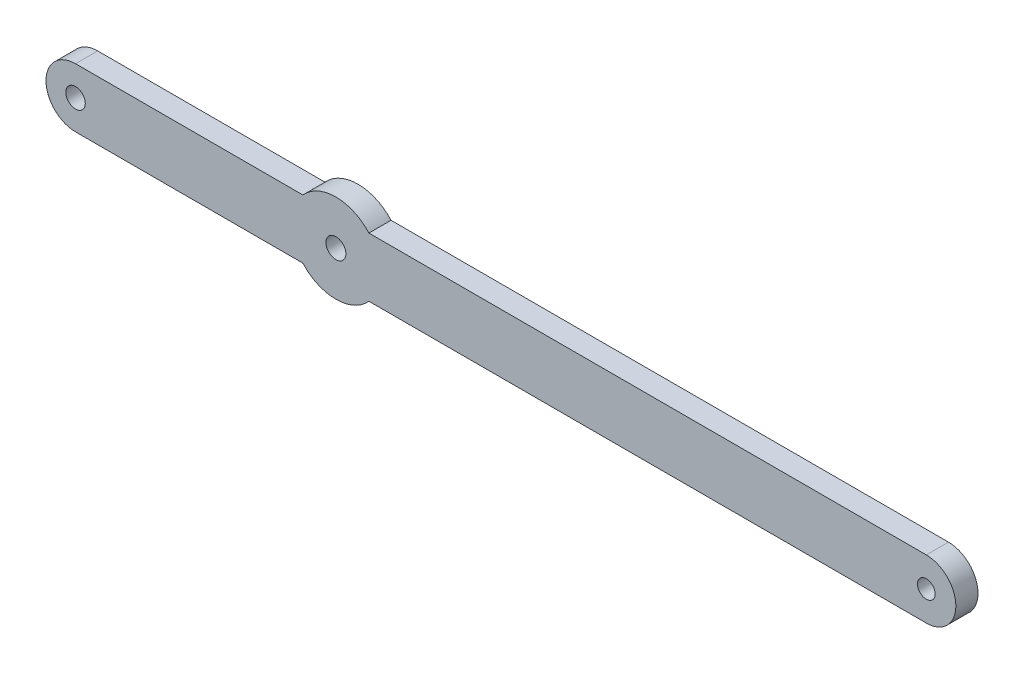
ISO-10303-21;
HEADER;
FILE_DESCRIPTION(('STEP AP214'),'2;1');
FILE_NAME('part.step','',(''),(''),'','','');
FILE_SCHEMA(('AUTOMOTIVE_DESIGN { 1 0 10303 214 1 1 1 1 }'));
ENDSEC;
DATA;
#1=APPLICATION_CONTEXT('core data for automotive mechanical design processes');
#2=APPLICATION_PROTOCOL_DEFINITION('international standard','automotive_design',2000,#1);
#3=PRODUCT_CONTEXT('',#1,'mechanical');
#4=PRODUCT('Part','Part','',(#3));
#5=PRODUCT_RELATED_PRODUCT_CATEGORY('part','',(#4));
#6=PRODUCT_DEFINITION_FORMATION('','',#4);
#7=PRODUCT_DEFINITION_CONTEXT('part definition',#1,'design');
#8=PRODUCT_DEFINITION('design','',#6,#7);
#9=PRODUCT_DEFINITION_SHAPE('','',#8);
#10=(LENGTH_UNIT() NAMED_UNIT(*) SI_UNIT(.MILLI.,.METRE.));
#11=(NAMED_UNIT(*) PLANE_ANGLE_UNIT() SI_UNIT($,.RADIAN.));
#12=(NAMED_UNIT(*) SI_UNIT($,.STERADIAN.) SOLID_ANGLE_UNIT());
#13=UNCERTAINTY_MEASURE_WITH_UNIT(LENGTH_MEASURE(1.E-05),#10,'distance_accuracy_value','');
#14=(GEOMETRIC_REPRESENTATION_CONTEXT(3) GLOBAL_UNCERTAINTY_ASSIGNED_CONTEXT((#13)) GLOBAL_UNIT_ASSIGNED_CONTEXT((#10,
#11,#12)) REPRESENTATION_CONTEXT('',''));
#15=CARTESIAN_POINT('',(0.,0.,0.));
#16=DIRECTION('',(0.,0.,1.));
#17=DIRECTION('',(1.,0.,0.));
#18=AXIS2_PLACEMENT_3D('',#15,#16,#17);
#19=CARTESIAN_POINT('',(-91.2186638136628,3.51409457484099,3.));
#20=DIRECTION('',(0.,0.,-1.));
#21=DIRECTION('',(-1.,0.,0.));
#22=AXIS2_PLACEMENT_3D('',#19,#20,#21);
#23=CYLINDRICAL_SURFACE('',#22,4.);
#24=CARTESIAN_POINT('',(-91.2186638136628,3.51409457484099,0.));
#25=DIRECTION('',(0.,0.,-1.));
#26=DIRECTION('',(-1.,0.,0.));
#27=AXIS2_PLACEMENT_3D('',#24,#25,#26);
#28=CIRCLE('',#27,4.);
#29=CARTESIAN_POINT('',(-91.2186638136628,-0.485905425159017,0.));
#30=VERTEX_POINT('',#29);
#31=CARTESIAN_POINT('',(-91.2186638136628,7.51409457484098,0.));
#32=VERTEX_POINT('',#31);
#33=EDGE_CURVE('E133',#30,#32,#28,.T.);
#34=ORIENTED_EDGE('',*,*,#33,.F.);
#35=DIRECTION('',(0.,0.,-1.));
#36=VECTOR('',#35,1.);
#37=CARTESIAN_POINT('',(-91.2186638136628,-0.485905425159017,3.));
#38=LINE('',#37,#36);
#39=CARTESIAN_POINT('',(-91.2186638136628,-0.485905425159017,3.));
#40=VERTEX_POINT('',#39);
#41=EDGE_CURVE('E11',#40,#30,#38,.T.);
#42=ORIENTED_EDGE('',*,*,#41,.F.);
#43=CARTESIAN_POINT('',(-91.2186638136628,3.51409457484099,3.));
#44=DIRECTION('',(0.,0.,-1.));
#45=DIRECTION('',(-1.,0.,0.));
#46=AXIS2_PLACEMENT_3D('',#43,#44,#45);
#47=CIRCLE('',#46,4.);
#48=CARTESIAN_POINT('',(-91.2186638136628,7.51409457484098,3.));
#49=VERTEX_POINT('',#48);
#50=EDGE_CURVE('E154',#40,#49,#47,.T.);
#51=ORIENTED_EDGE('',*,*,#50,.T.);
#52=DIRECTION('',(0.,0.,-1.));
#53=VECTOR('',#52,1.);
#54=CARTESIAN_POINT('',(-91.2186638136628,7.51409457484098,3.));
#55=LINE('',#54,#53);
#56=EDGE_CURVE('E39',#49,#32,#55,.T.);
#57=ORIENTED_EDGE('',*,*,#56,.T.);
#58=EDGE_LOOP('',(#34,#42,#51,#57));
#59=FACE_BOUND('',#58,.T.);
#60=ADVANCED_FACE('F36',(#59),#23,.T.);
#61=CARTESIAN_POINT('',(-60.4264175614243,-0.485905425159017,3.));
#62=DIRECTION('',(0.,-1.,0.));
#63=DIRECTION('',(0.,0.,-1.));
#64=AXIS2_PLACEMENT_3D('',#61,#62,#63);
#65=PLANE('',#64);
#66=DIRECTION('',(-1.,0.,0.));
#67=VECTOR('',#66,1.);
#68=CARTESIAN_POINT('',(-60.4264175614243,-0.485905425159017,0.));
#69=LINE('',#68,#67);
#70=CARTESIAN_POINT('',(-60.4264175614243,-0.485905425159017,0.));
#71=VERTEX_POINT('',#70);
#72=EDGE_CURVE('E152',#71,#30,#69,.T.);
#73=ORIENTED_EDGE('',*,*,#72,.F.);
#74=DIRECTION('',(0.,0.,-1.));
#75=VECTOR('',#74,1.);
#76=CARTESIAN_POINT('',(-60.4264175614243,-0.485905425159017,3.));
#77=LINE('',#76,#75);
#78=CARTESIAN_POINT('',(-60.4264175614243,-0.485905425159017,3.));
#79=VERTEX_POINT('',#78);
#80=EDGE_CURVE('E45',#79,#71,#77,.T.);
#81=ORIENTED_EDGE('',*,*,#80,.F.);
#82=DIRECTION('',(-1.,0.,0.));
#83=VECTOR('',#82,1.);
#84=CARTESIAN_POINT('',(-60.4264175614243,-0.485905425159017,3.));
#85=LINE('',#84,#83);
#86=EDGE_CURVE('E123',#79,#40,#85,.T.);
#87=ORIENTED_EDGE('',*,*,#86,.T.);
#88=ORIENTED_EDGE('',*,*,#41,.T.);
#89=EDGE_LOOP('',(#73,#81,#87,#88));
#90=FACE_BOUND('',#89,.T.);
#91=ADVANCED_FACE('F166',(#90),#65,.T.);
#92=CARTESIAN_POINT('',(-55.9542816064248,3.51409457484091,3.));
#93=DIRECTION('',(0.,0.,-1.));
#94=DIRECTION('',(-1.,0.,0.));
#95=AXIS2_PLACEMENT_3D('',#92,#93,#94);
#96=CYLINDRICAL_SURFACE('',#95,5.99999999999997);
#97=CARTESIAN_POINT('',(-55.9542816064248,3.51409457484091,0.));
#98=DIRECTION('',(0.,0.,-1.));
#99=DIRECTION('',(-1.,0.,0.));
#100=AXIS2_PLACEMENT_3D('',#97,#98,#99);
#101=CIRCLE('',#100,5.99999999999997);
#102=CARTESIAN_POINT('',(-51.4821456514252,-0.485905425158969,0.));
#103=VERTEX_POINT('',#102);
#104=EDGE_CURVE('E110',#103,#71,#101,.T.);
#105=ORIENTED_EDGE('',*,*,#104,.F.);
#106=DIRECTION('',(0.,0.,-1.));
#107=VECTOR('',#106,1.);
#108=CARTESIAN_POINT('',(-51.4821456514252,-0.485905425158969,3.));
#109=LINE('',#108,#107);
#110=CARTESIAN_POINT('',(-51.4821456514252,-0.485905425158969,3.));
#111=VERTEX_POINT('',#110);
#112=EDGE_CURVE('E105',#111,#103,#109,.T.);
#113=ORIENTED_EDGE('',*,*,#112,.F.);
#114=CARTESIAN_POINT('',(-55.9542816064248,3.51409457484091,3.));
#115=DIRECTION('',(0.,0.,-1.));
#116=DIRECTION('',(-1.,0.,0.));
#117=AXIS2_PLACEMENT_3D('',#114,#115,#116);
#118=CIRCLE('',#117,5.99999999999997);
#119=EDGE_CURVE('E108',#111,#79,#118,.T.);
#120=ORIENTED_EDGE('',*,*,#119,.T.);
#121=ORIENTED_EDGE('',*,*,#80,.T.);
#122=EDGE_LOOP('',(#105,#113,#120,#121));
#123=FACE_BOUND('',#122,.T.);
#124=ADVANCED_FACE('F107',(#123),#96,.T.);
#125=CARTESIAN_POINT('',(24.0198349794059,-0.485905425159017,3.));
#126=DIRECTION('',(0.,-1.,0.));
#127=DIRECTION('',(0.,0.,-1.));
#128=AXIS2_PLACEMENT_3D('',#125,#126,#127);
#129=PLANE('',#128);
#130=DIRECTION('',(-1.,0.,0.));
#131=VECTOR('',#130,1.);
#132=CARTESIAN_POINT('',(24.0198349794059,-0.485905425159017,0.));
#133=LINE('',#132,#131);
#134=CARTESIAN_POINT('',(24.0198349794059,-0.485905425159017,0.));
#135=VERTEX_POINT('',#134);
#136=EDGE_CURVE('E149',#135,#103,#133,.T.);
#137=ORIENTED_EDGE('',*,*,#136,.F.);
#138=DIRECTION('',(0.,0.,-1.));
#139=VECTOR('',#138,1.);
#140=CARTESIAN_POINT('',(24.0198349794059,-0.485905425159017,3.));
#141=LINE('',#140,#139);
#142=CARTESIAN_POINT('',(24.0198349794059,-0.485905425159017,3.));
#143=VERTEX_POINT('',#142);
#144=EDGE_CURVE('E115',#143,#135,#141,.T.);
#145=ORIENTED_EDGE('',*,*,#144,.F.);
#146=DIRECTION('',(-1.,0.,0.));
#147=VECTOR('',#146,1.);
#148=CARTESIAN_POINT('',(24.0198349794059,-0.485905425159017,3.));
#149=LINE('',#148,#147);
#150=EDGE_CURVE('E121',#143,#111,#149,.T.);
#151=ORIENTED_EDGE('',*,*,#150,.T.);
#152=ORIENTED_EDGE('',*,*,#112,.T.);
#153=EDGE_LOOP('',(#137,#145,#151,#152));
#154=FACE_BOUND('',#153,.T.);
#155=ADVANCED_FACE('F125',(#154),#129,.T.);
#156=CARTESIAN_POINT('',(24.0198349794059,3.51409457484099,3.));
#157=DIRECTION('',(0.,0.,-1.));
#158=DIRECTION('',(-1.,0.,0.));
#159=AXIS2_PLACEMENT_3D('',#156,#157,#158);
#160=CYLINDRICAL_SURFACE('',#159,4.);
#161=CARTESIAN_POINT('',(24.0198349794059,3.51409457484099,0.));
#162=DIRECTION('',(0.,0.,-1.));
#163=DIRECTION('',(-1.,0.,0.));
#164=AXIS2_PLACEMENT_3D('',#161,#162,#163);
#165=CIRCLE('',#164,4.);
#166=CARTESIAN_POINT('',(24.0198349794059,7.51409457484098,0.));
#167=VERTEX_POINT('',#166);
#168=EDGE_CURVE('E146',#167,#135,#165,.T.);
#169=ORIENTED_EDGE('',*,*,#168,.F.);
#170=DIRECTION('',(0.,0.,-1.));
#171=VECTOR('',#170,1.);
#172=CARTESIAN_POINT('',(24.0198349794059,7.51409457484098,3.));
#173=LINE('',#172,#171);
#174=CARTESIAN_POINT('',(24.0198349794059,7.51409457484098,3.));
#175=VERTEX_POINT('',#174);
#176=EDGE_CURVE('E158',#175,#167,#173,.T.);
#177=ORIENTED_EDGE('',*,*,#176,.F.);
#178=CARTESIAN_POINT('',(24.0198349794059,3.51409457484099,3.));
#179=DIRECTION('',(0.,0.,-1.));
#180=DIRECTION('',(-1.,0.,0.));
#181=AXIS2_PLACEMENT_3D('',#178,#179,#180);
#182=CIRCLE('',#181,4.);
#183=EDGE_CURVE('E126',#175,#143,#182,.T.);
#184=ORIENTED_EDGE('',*,*,#183,.T.);
#185=ORIENTED_EDGE('',*,*,#144,.T.);
#186=EDGE_LOOP('',(#169,#177,#184,#185));
#187=FACE_BOUND('',#186,.T.);
#188=ADVANCED_FACE('F179',(#187),#160,.T.);
#189=CARTESIAN_POINT('',(-51.4821456514252,7.51409457484098,3.));
#190=DIRECTION('',(0.,1.,0.));
#191=DIRECTION('',(0.,0.,1.));
#192=AXIS2_PLACEMENT_3D('',#189,#190,#191);
#193=PLANE('',#192);
#194=DIRECTION('',(1.,0.,0.));
#195=VECTOR('',#194,1.);
#196=CARTESIAN_POINT('',(-51.4821456514252,7.51409457484098,0.));
#197=LINE('',#196,#195);
#198=CARTESIAN_POINT('',(-51.4821456514252,7.51409457484098,0.));
#199=VERTEX_POINT('',#198);
#200=EDGE_CURVE('E143',#199,#167,#197,.T.);
#201=ORIENTED_EDGE('',*,*,#200,.F.);
#202=DIRECTION('',(0.,0.,-1.));
#203=VECTOR('',#202,1.);
#204=CARTESIAN_POINT('',(-51.4821456514252,7.51409457484098,3.));
#205=LINE('',#204,#203);
#206=CARTESIAN_POINT('',(-51.4821456514252,7.51409457484098,3.));
#207=VERTEX_POINT('',#206);
#208=EDGE_CURVE('E160',#207,#199,#205,.T.);
#209=ORIENTED_EDGE('',*,*,#208,.F.);
#210=DIRECTION('',(1.,0.,0.));
#211=VECTOR('',#210,1.);
#212=CARTESIAN_POINT('',(-51.4821456514252,7.51409457484098,3.));
#213=LINE('',#212,#211);
#214=EDGE_CURVE('E128',#207,#175,#213,.T.);
#215=ORIENTED_EDGE('',*,*,#214,.T.);
#216=ORIENTED_EDGE('',*,*,#176,.T.);
#217=EDGE_LOOP('',(#201,#209,#215,#216));
#218=FACE_BOUND('',#217,.T.);
#219=ADVANCED_FACE('F182',(#218),#193,.T.);
#220=CARTESIAN_POINT('',(-55.9542816064248,3.51409457484091,3.));
#221=DIRECTION('',(0.,0.,-1.));
#222=DIRECTION('',(-1.,0.,0.));
#223=AXIS2_PLACEMENT_3D('',#220,#221,#222);
#224=CYLINDRICAL_SURFACE('',#223,6.00000000000003);
#225=CARTESIAN_POINT('',(-55.9542816064248,3.51409457484091,0.));
#226=DIRECTION('',(0.,0.,-1.));
#227=DIRECTION('',(-1.,0.,0.));
#228=AXIS2_PLACEMENT_3D('',#225,#226,#227);
#229=CIRCLE('',#228,6.00000000000003);
#230=CARTESIAN_POINT('',(-60.4264175614243,7.514094574841,0.));
#231=VERTEX_POINT('',#230);
#232=EDGE_CURVE('E140',#231,#199,#229,.T.);
#233=ORIENTED_EDGE('',*,*,#232,.F.);
#234=DIRECTION('',(0.,0.,-1.));
#235=VECTOR('',#234,1.);
#236=CARTESIAN_POINT('',(-60.4264175614243,7.514094574841,3.));
#237=LINE('',#236,#235);
#238=CARTESIAN_POINT('',(-60.4264175614243,7.514094574841,3.));
#239=VERTEX_POINT('',#238);
#240=EDGE_CURVE('E161',#239,#231,#237,.T.);
#241=ORIENTED_EDGE('',*,*,#240,.F.);
#242=CARTESIAN_POINT('',(-55.9542816064248,3.51409457484091,3.));
#243=DIRECTION('',(0.,0.,-1.));
#244=DIRECTION('',(-1.,0.,0.));
#245=AXIS2_PLACEMENT_3D('',#242,#243,#244);
#246=CIRCLE('',#245,6.00000000000003);
#247=EDGE_CURVE('E238',#239,#207,#246,.T.);
#248=ORIENTED_EDGE('',*,*,#247,.T.);
#249=ORIENTED_EDGE('',*,*,#208,.T.);
#250=EDGE_LOOP('',(#233,#241,#248,#249));
#251=FACE_BOUND('',#250,.T.);
#252=ADVANCED_FACE('F186',(#251),#224,.T.);
#253=CARTESIAN_POINT('',(-91.2186638136628,7.51409457484098,3.));
#254=DIRECTION('',(0.,1.,0.));
#255=DIRECTION('',(0.,0.,1.));
#256=AXIS2_PLACEMENT_3D('',#253,#254,#255);
#257=PLANE('',#256);
#258=DIRECTION('',(1.,0.,0.));
#259=VECTOR('',#258,1.);
#260=CARTESIAN_POINT('',(-91.2186638136628,7.51409457484098,0.));
#261=LINE('',#260,#259);
#262=EDGE_CURVE('E136',#32,#231,#261,.T.);
#263=ORIENTED_EDGE('',*,*,#262,.F.);
#264=ORIENTED_EDGE('',*,*,#56,.F.);
#265=DIRECTION('',(1.,0.,0.));
#266=VECTOR('',#265,1.);
#267=CARTESIAN_POINT('',(-91.2186638136628,7.51409457484098,3.));
#268=LINE('',#267,#266);
#269=EDGE_CURVE('E236',#49,#239,#268,.T.);
#270=ORIENTED_EDGE('',*,*,#269,.T.);
#271=ORIENTED_EDGE('',*,*,#240,.T.);
#272=EDGE_LOOP('',(#263,#264,#270,#271));
#273=FACE_BOUND('',#272,.T.);
#274=ADVANCED_FACE('F163',(#273),#257,.T.);
#275=CARTESIAN_POINT('',(-91.2186638136628,3.51409457484099,3.));
#276=DIRECTION('',(0.,0.,-1.));
#277=DIRECTION('',(-1.,0.,0.));
#278=AXIS2_PLACEMENT_3D('',#275,#276,#277);
#279=PLANE('',#278);
#280=CARTESIAN_POINT('',(-91.2186638136628,3.51409457484099,3.));
#281=DIRECTION('',(0.,0.,-1.));
#282=DIRECTION('',(1.,0.,0.));
#283=AXIS2_PLACEMENT_3D('',#280,#281,#282);
#284=CIRCLE('',#283,1.32);
#285=CARTESIAN_POINT('',(-89.8986638136628,3.51409457484099,3.));
#286=VERTEX_POINT('',#285);
#287=EDGE_CURVE('E217',#286,#286,#284,.T.);
#288=ORIENTED_EDGE('',*,*,#287,.T.);
#289=EDGE_LOOP('',(#288));
#290=FACE_BOUND('',#289,.T.);
#291=CARTESIAN_POINT('',(-55.9542816064248,3.51409457484091,3.));
#292=DIRECTION('',(0.,0.,-1.));
#293=DIRECTION('',(1.,0.,0.));
#294=AXIS2_PLACEMENT_3D('',#291,#292,#293);
#295=CIRCLE('',#294,1.35);
#296=CARTESIAN_POINT('',(-54.6042816064248,3.51409457484091,3.));
#297=VERTEX_POINT('',#296);
#298=EDGE_CURVE('E225',#297,#297,#295,.T.);
#299=ORIENTED_EDGE('',*,*,#298,.T.);
#300=EDGE_LOOP('',(#299));
#301=FACE_BOUND('',#300,.T.);
#302=CARTESIAN_POINT('',(24.0203966544439,3.51409457484091,3.));
#303=DIRECTION('',(0.,0.,-1.));
#304=DIRECTION('',(1.,0.,0.));
#305=AXIS2_PLACEMENT_3D('',#302,#303,#304);
#306=CIRCLE('',#305,1.2);
#307=CARTESIAN_POINT('',(25.2203966544439,3.51409457484091,3.));
#308=VERTEX_POINT('',#307);
#309=EDGE_CURVE('E137',#308,#308,#306,.T.);
#310=ORIENTED_EDGE('',*,*,#309,.T.);
#311=EDGE_LOOP('',(#310));
#312=FACE_BOUND('',#311,.T.);
#313=ORIENTED_EDGE('',*,*,#50,.F.);
#314=ORIENTED_EDGE('',*,*,#86,.F.);
#315=ORIENTED_EDGE('',*,*,#119,.F.);
#316=ORIENTED_EDGE('',*,*,#150,.F.);
#317=ORIENTED_EDGE('',*,*,#183,.F.);
#318=ORIENTED_EDGE('',*,*,#214,.F.);
#319=ORIENTED_EDGE('',*,*,#247,.F.);
#320=ORIENTED_EDGE('',*,*,#269,.F.);
#321=EDGE_LOOP('',(#313,#314,#315,#316,#317,#318,#319,#320));
#322=FACE_BOUND('',#321,.T.);
#323=ADVANCED_FACE('F119',(#290,#301,#312,#322),#279,.F.);
#324=CARTESIAN_POINT('',(-91.2186638136628,3.51409457484099,0.));
#325=DIRECTION('',(0.,0.,-1.));
#326=DIRECTION('',(-1.,0.,0.));
#327=AXIS2_PLACEMENT_3D('',#324,#325,#326);
#328=PLANE('',#327);
#329=CARTESIAN_POINT('',(-91.2186638136628,3.51409457484099,0.));
#330=DIRECTION('',(0.,0.,-1.));
#331=DIRECTION('',(1.,0.,0.));
#332=AXIS2_PLACEMENT_3D('',#329,#330,#331);
#333=CIRCLE('',#332,1.32);
#334=CARTESIAN_POINT('',(-89.8986638136628,3.51409457484099,0.));
#335=VERTEX_POINT('',#334);
#336=EDGE_CURVE('E220',#335,#335,#333,.T.);
#337=ORIENTED_EDGE('',*,*,#336,.F.);
#338=EDGE_LOOP('',(#337));
#339=FACE_BOUND('',#338,.T.);
#340=CARTESIAN_POINT('',(-55.9542816064248,3.51409457484091,0.));
#341=DIRECTION('',(0.,0.,-1.));
#342=DIRECTION('',(1.,0.,0.));
#343=AXIS2_PLACEMENT_3D('',#340,#341,#342);
#344=CIRCLE('',#343,1.35);
#345=CARTESIAN_POINT('',(-54.6042816064248,3.51409457484091,0.));
#346=VERTEX_POINT('',#345);
#347=EDGE_CURVE('E222',#346,#346,#344,.T.);
#348=ORIENTED_EDGE('',*,*,#347,.F.);
#349=EDGE_LOOP('',(#348));
#350=FACE_BOUND('',#349,.T.);
#351=CARTESIAN_POINT('',(24.0203966544439,3.51409457484091,0.));
#352=DIRECTION('',(0.,0.,-1.));
#353=DIRECTION('',(1.,0.,0.));
#354=AXIS2_PLACEMENT_3D('',#351,#352,#353);
#355=CIRCLE('',#354,1.2);
#356=CARTESIAN_POINT('',(25.2203966544439,3.51409457484091,0.));
#357=VERTEX_POINT('',#356);
#358=EDGE_CURVE('E228',#357,#357,#355,.T.);
#359=ORIENTED_EDGE('',*,*,#358,.F.);
#360=EDGE_LOOP('',(#359));
#361=FACE_BOUND('',#360,.T.);
#362=ORIENTED_EDGE('',*,*,#33,.T.);
#363=ORIENTED_EDGE('',*,*,#262,.T.);
#364=ORIENTED_EDGE('',*,*,#232,.T.);
#365=ORIENTED_EDGE('',*,*,#200,.T.);
#366=ORIENTED_EDGE('',*,*,#168,.T.);
#367=ORIENTED_EDGE('',*,*,#136,.T.);
#368=ORIENTED_EDGE('',*,*,#104,.T.);
#369=ORIENTED_EDGE('',*,*,#72,.T.);
#370=EDGE_LOOP('',(#362,#363,#364,#365,#366,#367,#368,#369));
#371=FACE_BOUND('',#370,.T.);
#372=ADVANCED_FACE('F165',(#339,#350,#361,#371),#328,.T.);
#373=CARTESIAN_POINT('',(24.0203966544439,3.51409457484091,3.));
#374=DIRECTION('',(0.,0.,-1.));
#375=DIRECTION('',(-1.,0.,0.));
#376=AXIS2_PLACEMENT_3D('',#373,#374,#375);
#377=CYLINDRICAL_SURFACE('',#376,1.2);
#378=ORIENTED_EDGE('',*,*,#309,.F.);
#379=EDGE_LOOP('',(#378));
#380=FACE_BOUND('',#379,.T.);
#381=ORIENTED_EDGE('',*,*,#358,.T.);
#382=EDGE_LOOP('',(#381));
#383=FACE_BOUND('',#382,.T.);
#384=ADVANCED_FACE('F198',(#380,#383),#377,.F.);
#385=CARTESIAN_POINT('',(-55.9542816064248,3.51409457484091,3.));
#386=DIRECTION('',(0.,0.,-1.));
#387=DIRECTION('',(-1.,0.,0.));
#388=AXIS2_PLACEMENT_3D('',#385,#386,#387);
#389=CYLINDRICAL_SURFACE('',#388,1.35);
#390=ORIENTED_EDGE('',*,*,#298,.F.);
#391=EDGE_LOOP('',(#390));
#392=FACE_BOUND('',#391,.T.);
#393=ORIENTED_EDGE('',*,*,#347,.T.);
#394=EDGE_LOOP('',(#393));
#395=FACE_BOUND('',#394,.T.);
#396=ADVANCED_FACE('F205',(#392,#395),#389,.F.);
#397=CARTESIAN_POINT('',(-91.2186638136628,3.51409457484099,3.));
#398=DIRECTION('',(0.,0.,-1.));
#399=DIRECTION('',(-1.,0.,0.));
#400=AXIS2_PLACEMENT_3D('',#397,#398,#399);
#401=CYLINDRICAL_SURFACE('',#400,1.32);
#402=ORIENTED_EDGE('',*,*,#287,.F.);
#403=EDGE_LOOP('',(#402));
#404=FACE_BOUND('',#403,.T.);
#405=ORIENTED_EDGE('',*,*,#336,.T.);
#406=EDGE_LOOP('',(#405));
#407=FACE_BOUND('',#406,.T.);
#408=ADVANCED_FACE('F209',(#404,#407),#401,.F.);
#409=CLOSED_SHELL('',(#60,#91,#124,#155,#188,#219,#252,#274,#323,#372,#384,#396,#408));
#410=MANIFOLD_SOLID_BREP('B2',#409);
#411=ADVANCED_BREP_SHAPE_REPRESENTATION('',(#18,#410),#14);
#412=SHAPE_DEFINITION_REPRESENTATION(#9,#411);
ENDSEC;
END-ISO-10303-21;
